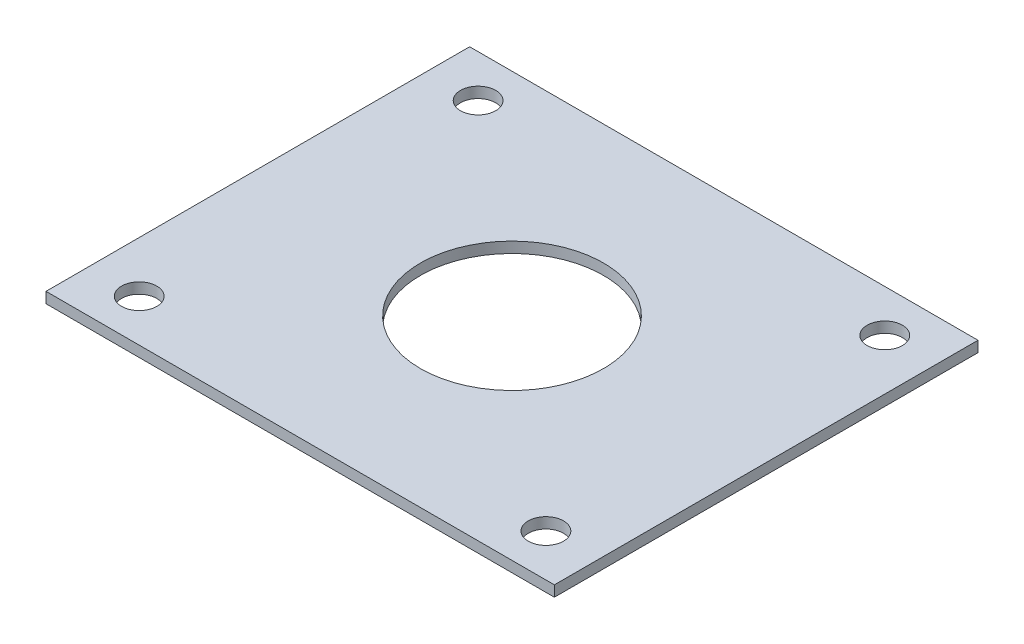
ISO-10303-21;
HEADER;
FILE_DESCRIPTION(('STEP AP214'),'2;1');
FILE_NAME('part.step','',(''),(''),'','','');
FILE_SCHEMA(('AUTOMOTIVE_DESIGN { 1 0 10303 214 1 1 1 1 }'));
ENDSEC;
DATA;
#1=APPLICATION_CONTEXT('core data for automotive mechanical design processes');
#2=APPLICATION_PROTOCOL_DEFINITION('international standard','automotive_design',2000,#1);
#3=PRODUCT_CONTEXT('',#1,'mechanical');
#4=PRODUCT('Part','Part','',(#3));
#5=PRODUCT_RELATED_PRODUCT_CATEGORY('part','',(#4));
#6=PRODUCT_DEFINITION_FORMATION('','',#4);
#7=PRODUCT_DEFINITION_CONTEXT('part definition',#1,'design');
#8=PRODUCT_DEFINITION('design','',#6,#7);
#9=PRODUCT_DEFINITION_SHAPE('','',#8);
#10=(LENGTH_UNIT() NAMED_UNIT(*) SI_UNIT(.MILLI.,.METRE.));
#11=(NAMED_UNIT(*) PLANE_ANGLE_UNIT() SI_UNIT($,.RADIAN.));
#12=(NAMED_UNIT(*) SI_UNIT($,.STERADIAN.) SOLID_ANGLE_UNIT());
#13=UNCERTAINTY_MEASURE_WITH_UNIT(LENGTH_MEASURE(1.E-05),#10,'distance_accuracy_value','');
#14=(GEOMETRIC_REPRESENTATION_CONTEXT(3) GLOBAL_UNCERTAINTY_ASSIGNED_CONTEXT((#13)) GLOBAL_UNIT_ASSIGNED_CONTEXT((#10,
#11,#12)) REPRESENTATION_CONTEXT('',''));
#15=CARTESIAN_POINT('',(0.,0.,0.));
#16=DIRECTION('',(0.,0.,1.));
#17=DIRECTION('',(1.,0.,0.));
#18=AXIS2_PLACEMENT_3D('',#15,#16,#17);
#19=CARTESIAN_POINT('',(37.5,-0.79375,31.25));
#20=DIRECTION('',(1.,0.,0.));
#21=DIRECTION('',(0.,0.,-1.));
#22=AXIS2_PLACEMENT_3D('',#19,#20,#21);
#23=PLANE('',#22);
#24=DIRECTION('',(0.,1.,0.));
#25=VECTOR('',#24,1.);
#26=CARTESIAN_POINT('',(37.5,-0.79375,-31.25));
#27=LINE('',#26,#25);
#28=CARTESIAN_POINT('',(37.5,-0.79375,-31.25));
#29=VERTEX_POINT('',#28);
#30=CARTESIAN_POINT('',(37.5,0.79375,-31.25));
#31=VERTEX_POINT('',#30);
#32=EDGE_CURVE('E36',#29,#31,#27,.T.);
#33=ORIENTED_EDGE('',*,*,#32,.T.);
#34=DIRECTION('',(0.,0.,-1.));
#35=VECTOR('',#34,1.);
#36=CARTESIAN_POINT('',(37.5,0.79375,31.25));
#37=LINE('',#36,#35);
#38=CARTESIAN_POINT('',(37.5,0.79375,31.25));
#39=VERTEX_POINT('',#38);
#40=EDGE_CURVE('E73',#39,#31,#37,.T.);
#41=ORIENTED_EDGE('',*,*,#40,.F.);
#42=DIRECTION('',(0.,1.,0.));
#43=VECTOR('',#42,1.);
#44=CARTESIAN_POINT('',(37.5,-0.79375,31.25));
#45=LINE('',#44,#43);
#46=CARTESIAN_POINT('',(37.5,-0.79375,31.25));
#47=VERTEX_POINT('',#46);
#48=EDGE_CURVE('E11',#47,#39,#45,.T.);
#49=ORIENTED_EDGE('',*,*,#48,.F.);
#50=DIRECTION('',(0.,0.,-1.));
#51=VECTOR('',#50,1.);
#52=CARTESIAN_POINT('',(37.5,-0.79375,31.25));
#53=LINE('',#52,#51);
#54=EDGE_CURVE('E74',#47,#29,#53,.T.);
#55=ORIENTED_EDGE('',*,*,#54,.T.);
#56=EDGE_LOOP('',(#33,#41,#49,#55));
#57=FACE_BOUND('',#56,.T.);
#58=ADVANCED_FACE('F33',(#57),#23,.T.);
#59=CARTESIAN_POINT('',(-37.5,-0.79375,31.25));
#60=DIRECTION('',(0.,0.,1.));
#61=DIRECTION('',(1.,0.,0.));
#62=AXIS2_PLACEMENT_3D('',#59,#60,#61);
#63=PLANE('',#62);
#64=ORIENTED_EDGE('',*,*,#48,.T.);
#65=DIRECTION('',(1.,0.,0.));
#66=VECTOR('',#65,1.);
#67=CARTESIAN_POINT('',(-37.5,0.79375,31.25));
#68=LINE('',#67,#66);
#69=CARTESIAN_POINT('',(-37.5,0.79375,31.25));
#70=VERTEX_POINT('',#69);
#71=EDGE_CURVE('E91',#70,#39,#68,.T.);
#72=ORIENTED_EDGE('',*,*,#71,.F.);
#73=DIRECTION('',(0.,1.,0.));
#74=VECTOR('',#73,1.);
#75=CARTESIAN_POINT('',(-37.5,-0.79375,31.25));
#76=LINE('',#75,#74);
#77=CARTESIAN_POINT('',(-37.5,-0.79375,31.25));
#78=VERTEX_POINT('',#77);
#79=EDGE_CURVE('E41',#78,#70,#76,.T.);
#80=ORIENTED_EDGE('',*,*,#79,.F.);
#81=DIRECTION('',(1.,0.,0.));
#82=VECTOR('',#81,1.);
#83=CARTESIAN_POINT('',(-37.5,-0.79375,31.25));
#84=LINE('',#83,#82);
#85=EDGE_CURVE('E79',#78,#47,#84,.T.);
#86=ORIENTED_EDGE('',*,*,#85,.T.);
#87=EDGE_LOOP('',(#64,#72,#80,#86));
#88=FACE_BOUND('',#87,.T.);
#89=ADVANCED_FACE('F126',(#88),#63,.T.);
#90=CARTESIAN_POINT('',(-37.5,-0.79375,31.25));
#91=DIRECTION('',(-1.,0.,0.));
#92=DIRECTION('',(0.,0.,1.));
#93=AXIS2_PLACEMENT_3D('',#90,#91,#92);
#94=PLANE('',#93);
#95=ORIENTED_EDGE('',*,*,#79,.T.);
#96=DIRECTION('',(0.,0.,1.));
#97=VECTOR('',#96,1.);
#98=CARTESIAN_POINT('',(-37.5,0.79375,31.25));
#99=LINE('',#98,#97);
#100=CARTESIAN_POINT('',(-37.5,0.79375,-31.25));
#101=VERTEX_POINT('',#100);
#102=EDGE_CURVE('E86',#101,#70,#99,.T.);
#103=ORIENTED_EDGE('',*,*,#102,.F.);
#104=DIRECTION('',(0.,1.,0.));
#105=VECTOR('',#104,1.);
#106=CARTESIAN_POINT('',(-37.5,-0.79375,-31.25));
#107=LINE('',#106,#105);
#108=CARTESIAN_POINT('',(-37.5,-0.79375,-31.25));
#109=VERTEX_POINT('',#108);
#110=EDGE_CURVE('E78',#109,#101,#107,.T.);
#111=ORIENTED_EDGE('',*,*,#110,.F.);
#112=DIRECTION('',(0.,0.,1.));
#113=VECTOR('',#112,1.);
#114=CARTESIAN_POINT('',(-37.5,-0.79375,31.25));
#115=LINE('',#114,#113);
#116=EDGE_CURVE('E119',#109,#78,#115,.T.);
#117=ORIENTED_EDGE('',*,*,#116,.T.);
#118=EDGE_LOOP('',(#95,#103,#111,#117));
#119=FACE_BOUND('',#118,.T.);
#120=ADVANCED_FACE('F123',(#119),#94,.T.);
#121=CARTESIAN_POINT('',(-37.5,-0.79375,-31.25));
#122=DIRECTION('',(0.,0.,-1.));
#123=DIRECTION('',(-1.,0.,0.));
#124=AXIS2_PLACEMENT_3D('',#121,#122,#123);
#125=PLANE('',#124);
#126=ORIENTED_EDGE('',*,*,#110,.T.);
#127=DIRECTION('',(-1.,0.,0.));
#128=VECTOR('',#127,1.);
#129=CARTESIAN_POINT('',(-37.5,0.79375,-31.25));
#130=LINE('',#129,#128);
#131=EDGE_CURVE('E81',#31,#101,#130,.T.);
#132=ORIENTED_EDGE('',*,*,#131,.F.);
#133=ORIENTED_EDGE('',*,*,#32,.F.);
#134=DIRECTION('',(-1.,0.,0.));
#135=VECTOR('',#134,1.);
#136=CARTESIAN_POINT('',(-37.5,-0.79375,-31.25));
#137=LINE('',#136,#135);
#138=EDGE_CURVE('E117',#29,#109,#137,.T.);
#139=ORIENTED_EDGE('',*,*,#138,.T.);
#140=EDGE_LOOP('',(#126,#132,#133,#139));
#141=FACE_BOUND('',#140,.T.);
#142=ADVANCED_FACE('F82',(#141),#125,.T.);
#143=CARTESIAN_POINT('',(0.,-0.79375,0.));
#144=DIRECTION('',(0.,-1.,0.));
#145=DIRECTION('',(0.,0.,-1.));
#146=AXIS2_PLACEMENT_3D('',#143,#144,#145);
#147=PLANE('',#146);
#148=CARTESIAN_POINT('',(-30.,-0.79375,25.));
#149=DIRECTION('',(0.,1.,0.));
#150=DIRECTION('',(0.,0.,1.));
#151=AXIS2_PLACEMENT_3D('',#148,#149,#150);
#152=CIRCLE('',#151,2.6);
#153=CARTESIAN_POINT('',(-30.,-0.79375,27.6));
#154=VERTEX_POINT('',#153);
#155=EDGE_CURVE('E101',#154,#154,#152,.T.);
#156=ORIENTED_EDGE('',*,*,#155,.T.);
#157=EDGE_LOOP('',(#156));
#158=FACE_BOUND('',#157,.T.);
#159=CARTESIAN_POINT('',(30.,-0.79375,25.));
#160=DIRECTION('',(0.,1.,0.));
#161=DIRECTION('',(0.,0.,-1.));
#162=AXIS2_PLACEMENT_3D('',#159,#160,#161);
#163=CIRCLE('',#162,2.59999999999999);
#164=CARTESIAN_POINT('',(30.,-0.79375,22.4));
#165=VERTEX_POINT('',#164);
#166=EDGE_CURVE('E104',#165,#165,#163,.T.);
#167=ORIENTED_EDGE('',*,*,#166,.T.);
#168=EDGE_LOOP('',(#167));
#169=FACE_BOUND('',#168,.T.);
#170=CARTESIAN_POINT('',(-30.,-0.79375,-25.));
#171=DIRECTION('',(0.,1.,0.));
#172=DIRECTION('',(0.,0.,-1.));
#173=AXIS2_PLACEMENT_3D('',#170,#171,#172);
#174=CIRCLE('',#173,2.6);
#175=CARTESIAN_POINT('',(-30.,-0.79375,-27.6));
#176=VERTEX_POINT('',#175);
#177=EDGE_CURVE('E107',#176,#176,#174,.T.);
#178=ORIENTED_EDGE('',*,*,#177,.T.);
#179=EDGE_LOOP('',(#178));
#180=FACE_BOUND('',#179,.T.);
#181=CARTESIAN_POINT('',(30.,-0.79375,-25.));
#182=DIRECTION('',(0.,1.,0.));
#183=DIRECTION('',(0.,0.,1.));
#184=AXIS2_PLACEMENT_3D('',#181,#182,#183);
#185=CIRCLE('',#184,2.59999999999999);
#186=CARTESIAN_POINT('',(30.,-0.79375,-22.4));
#187=VERTEX_POINT('',#186);
#188=EDGE_CURVE('E110',#187,#187,#185,.T.);
#189=ORIENTED_EDGE('',*,*,#188,.T.);
#190=EDGE_LOOP('',(#189));
#191=FACE_BOUND('',#190,.T.);
#192=CARTESIAN_POINT('',(0.,-0.79375,0.));
#193=DIRECTION('',(0.,1.,0.));
#194=DIRECTION('',(0.,0.,1.));
#195=AXIS2_PLACEMENT_3D('',#192,#193,#194);
#196=CIRCLE('',#195,13.5);
#197=CARTESIAN_POINT('',(0.,-0.79375,13.5));
#198=VERTEX_POINT('',#197);
#199=EDGE_CURVE('E113',#198,#198,#196,.T.);
#200=ORIENTED_EDGE('',*,*,#199,.T.);
#201=EDGE_LOOP('',(#200));
#202=FACE_BOUND('',#201,.T.);
#203=ORIENTED_EDGE('',*,*,#54,.F.);
#204=ORIENTED_EDGE('',*,*,#85,.F.);
#205=ORIENTED_EDGE('',*,*,#116,.F.);
#206=ORIENTED_EDGE('',*,*,#138,.F.);
#207=EDGE_LOOP('',(#203,#204,#205,#206));
#208=FACE_BOUND('',#207,.T.);
#209=ADVANCED_FACE('F128',(#158,#169,#180,#191,#202,#208),#147,.T.);
#210=CARTESIAN_POINT('',(0.,-0.79375,0.));
#211=DIRECTION('',(0.,1.,0.));
#212=DIRECTION('',(0.,0.,1.));
#213=AXIS2_PLACEMENT_3D('',#210,#211,#212);
#214=CYLINDRICAL_SURFACE('',#213,13.5);
#215=ORIENTED_EDGE('',*,*,#199,.F.);
#216=EDGE_LOOP('',(#215));
#217=FACE_BOUND('',#216,.T.);
#218=CARTESIAN_POINT('',(0.,0.79375,0.));
#219=DIRECTION('',(0.,1.,0.));
#220=DIRECTION('',(0.,0.,1.));
#221=AXIS2_PLACEMENT_3D('',#218,#219,#220);
#222=CIRCLE('',#221,13.5);
#223=CARTESIAN_POINT('',(0.,0.79375,13.5));
#224=VERTEX_POINT('',#223);
#225=EDGE_CURVE('E92',#224,#224,#222,.T.);
#226=ORIENTED_EDGE('',*,*,#225,.T.);
#227=EDGE_LOOP('',(#226));
#228=FACE_BOUND('',#227,.T.);
#229=ADVANCED_FACE('F130',(#217,#228),#214,.F.);
#230=CARTESIAN_POINT('',(30.,-0.79375,-25.));
#231=DIRECTION('',(0.,1.,0.));
#232=DIRECTION('',(0.,0.,1.));
#233=AXIS2_PLACEMENT_3D('',#230,#231,#232);
#234=CYLINDRICAL_SURFACE('',#233,2.59999999999999);
#235=ORIENTED_EDGE('',*,*,#188,.F.);
#236=EDGE_LOOP('',(#235));
#237=FACE_BOUND('',#236,.T.);
#238=CARTESIAN_POINT('',(30.,0.79375,-25.));
#239=DIRECTION('',(0.,1.,0.));
#240=DIRECTION('',(0.,0.,1.));
#241=AXIS2_PLACEMENT_3D('',#238,#239,#240);
#242=CIRCLE('',#241,2.59999999999999);
#243=CARTESIAN_POINT('',(30.,0.79375,-22.4));
#244=VERTEX_POINT('',#243);
#245=EDGE_CURVE('E95',#244,#244,#242,.T.);
#246=ORIENTED_EDGE('',*,*,#245,.T.);
#247=EDGE_LOOP('',(#246));
#248=FACE_BOUND('',#247,.T.);
#249=ADVANCED_FACE('F137',(#237,#248),#234,.F.);
#250=CARTESIAN_POINT('',(-30.,-0.79375,-25.));
#251=DIRECTION('',(0.,1.,0.));
#252=DIRECTION('',(0.,0.,1.));
#253=AXIS2_PLACEMENT_3D('',#250,#251,#252);
#254=CYLINDRICAL_SURFACE('',#253,2.6);
#255=ORIENTED_EDGE('',*,*,#177,.F.);
#256=EDGE_LOOP('',(#255));
#257=FACE_BOUND('',#256,.T.);
#258=CARTESIAN_POINT('',(-30.,0.79375,-25.));
#259=DIRECTION('',(0.,1.,0.));
#260=DIRECTION('',(0.,0.,-1.));
#261=AXIS2_PLACEMENT_3D('',#258,#259,#260);
#262=CIRCLE('',#261,2.6);
#263=CARTESIAN_POINT('',(-30.,0.79375,-27.6));
#264=VERTEX_POINT('',#263);
#265=EDGE_CURVE('E226',#264,#264,#262,.T.);
#266=ORIENTED_EDGE('',*,*,#265,.T.);
#267=EDGE_LOOP('',(#266));
#268=FACE_BOUND('',#267,.T.);
#269=ADVANCED_FACE('F175',(#257,#268),#254,.F.);
#270=CARTESIAN_POINT('',(30.,-0.79375,25.));
#271=DIRECTION('',(0.,1.,0.));
#272=DIRECTION('',(0.,0.,1.));
#273=AXIS2_PLACEMENT_3D('',#270,#271,#272);
#274=CYLINDRICAL_SURFACE('',#273,2.59999999999999);
#275=ORIENTED_EDGE('',*,*,#166,.F.);
#276=EDGE_LOOP('',(#275));
#277=FACE_BOUND('',#276,.T.);
#278=CARTESIAN_POINT('',(30.,0.79375,25.));
#279=DIRECTION('',(0.,1.,0.));
#280=DIRECTION('',(0.,0.,-1.));
#281=AXIS2_PLACEMENT_3D('',#278,#279,#280);
#282=CIRCLE('',#281,2.59999999999999);
#283=CARTESIAN_POINT('',(30.,0.79375,22.4));
#284=VERTEX_POINT('',#283);
#285=EDGE_CURVE('E223',#284,#284,#282,.T.);
#286=ORIENTED_EDGE('',*,*,#285,.T.);
#287=EDGE_LOOP('',(#286));
#288=FACE_BOUND('',#287,.T.);
#289=ADVANCED_FACE('F185',(#277,#288),#274,.F.);
#290=CARTESIAN_POINT('',(-30.,-0.79375,25.));
#291=DIRECTION('',(0.,1.,0.));
#292=DIRECTION('',(0.,0.,1.));
#293=AXIS2_PLACEMENT_3D('',#290,#291,#292);
#294=CYLINDRICAL_SURFACE('',#293,2.6);
#295=ORIENTED_EDGE('',*,*,#155,.F.);
#296=EDGE_LOOP('',(#295));
#297=FACE_BOUND('',#296,.T.);
#298=CARTESIAN_POINT('',(-30.,0.79375,25.));
#299=DIRECTION('',(0.,1.,0.));
#300=DIRECTION('',(0.,0.,1.));
#301=AXIS2_PLACEMENT_3D('',#298,#299,#300);
#302=CIRCLE('',#301,2.6);
#303=CARTESIAN_POINT('',(-30.,0.79375,27.6));
#304=VERTEX_POINT('',#303);
#305=EDGE_CURVE('E221',#304,#304,#302,.T.);
#306=ORIENTED_EDGE('',*,*,#305,.T.);
#307=EDGE_LOOP('',(#306));
#308=FACE_BOUND('',#307,.T.);
#309=ADVANCED_FACE('F195',(#297,#308),#294,.F.);
#310=CARTESIAN_POINT('',(0.,0.79375,0.));
#311=DIRECTION('',(0.,-1.,0.));
#312=DIRECTION('',(0.,0.,-1.));
#313=AXIS2_PLACEMENT_3D('',#310,#311,#312);
#314=PLANE('',#313);
#315=ORIENTED_EDGE('',*,*,#40,.T.);
#316=ORIENTED_EDGE('',*,*,#131,.T.);
#317=ORIENTED_EDGE('',*,*,#102,.T.);
#318=ORIENTED_EDGE('',*,*,#71,.T.);
#319=EDGE_LOOP('',(#315,#316,#317,#318));
#320=FACE_BOUND('',#319,.T.);
#321=ORIENTED_EDGE('',*,*,#225,.F.);
#322=EDGE_LOOP('',(#321));
#323=FACE_BOUND('',#322,.T.);
#324=ORIENTED_EDGE('',*,*,#245,.F.);
#325=EDGE_LOOP('',(#324));
#326=FACE_BOUND('',#325,.T.);
#327=ORIENTED_EDGE('',*,*,#265,.F.);
#328=EDGE_LOOP('',(#327));
#329=FACE_BOUND('',#328,.T.);
#330=ORIENTED_EDGE('',*,*,#285,.F.);
#331=EDGE_LOOP('',(#330));
#332=FACE_BOUND('',#331,.T.);
#333=ORIENTED_EDGE('',*,*,#305,.F.);
#334=EDGE_LOOP('',(#333));
#335=FACE_BOUND('',#334,.T.);
#336=ADVANCED_FACE('F89',(#320,#323,#326,#329,#332,#335),#314,.F.);
#337=CLOSED_SHELL('',(#58,#89,#120,#142,#209,#229,#249,#269,#289,#309,#336));
#338=MANIFOLD_SOLID_BREP('B2',#337);
#339=ADVANCED_BREP_SHAPE_REPRESENTATION('',(#18,#338),#14);
#340=SHAPE_DEFINITION_REPRESENTATION(#9,#339);
ENDSEC;
END-ISO-10303-21;
